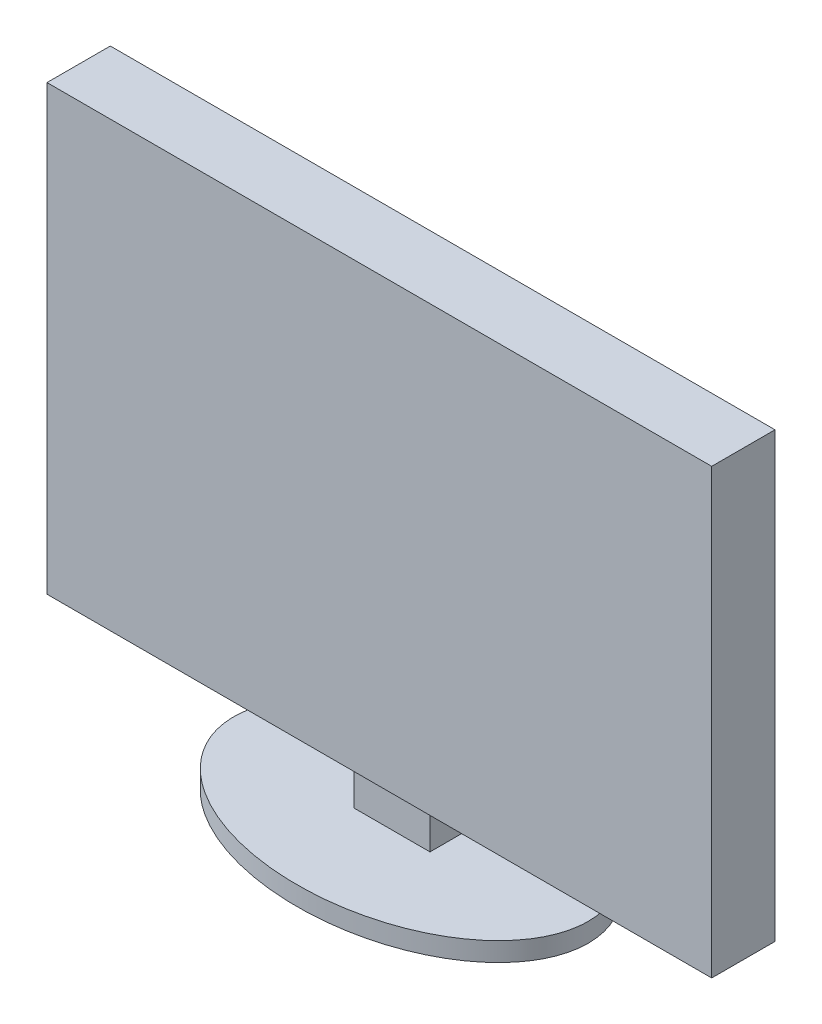
ISO-10303-21;
HEADER;
FILE_DESCRIPTION(('STEP AP214'),'2;1');
FILE_NAME('part.step','',(''),(''),'','','');
FILE_SCHEMA(('AUTOMOTIVE_DESIGN { 1 0 10303 214 1 1 1 1 }'));
ENDSEC;
DATA;
#1=APPLICATION_CONTEXT('core data for automotive mechanical design processes');
#2=APPLICATION_PROTOCOL_DEFINITION('international standard','automotive_design',2000,#1);
#3=PRODUCT_CONTEXT('',#1,'mechanical');
#4=PRODUCT('Part','Part','',(#3));
#5=PRODUCT_RELATED_PRODUCT_CATEGORY('part','',(#4));
#6=PRODUCT_DEFINITION_FORMATION('','',#4);
#7=PRODUCT_DEFINITION_CONTEXT('part definition',#1,'design');
#8=PRODUCT_DEFINITION('design','',#6,#7);
#9=PRODUCT_DEFINITION_SHAPE('','',#8);
#10=(LENGTH_UNIT() NAMED_UNIT(*) SI_UNIT(.MILLI.,.METRE.));
#11=(NAMED_UNIT(*) PLANE_ANGLE_UNIT() SI_UNIT($,.RADIAN.));
#12=(NAMED_UNIT(*) SI_UNIT($,.STERADIAN.) SOLID_ANGLE_UNIT());
#13=UNCERTAINTY_MEASURE_WITH_UNIT(LENGTH_MEASURE(1.E-05),#10,'distance_accuracy_value','');
#14=(GEOMETRIC_REPRESENTATION_CONTEXT(3) GLOBAL_UNCERTAINTY_ASSIGNED_CONTEXT((#13)) GLOBAL_UNIT_ASSIGNED_CONTEXT((#10,
#11,#12)) REPRESENTATION_CONTEXT('',''));
#15=CARTESIAN_POINT('',(0.,0.,0.));
#16=DIRECTION('',(0.,0.,1.));
#17=DIRECTION('',(1.,0.,0.));
#18=AXIS2_PLACEMENT_3D('',#15,#16,#17);
#19=CARTESIAN_POINT('',(0.,15.,0.));
#20=DIRECTION('',(0.,1.,0.));
#21=DIRECTION('',(0.,0.,1.));
#22=AXIS2_PLACEMENT_3D('',#19,#20,#21);
#23=PLANE('',#22);
#24=CARTESIAN_POINT('',(0.,15.,0.));
#25=DIRECTION('',(0.,1.,0.));
#26=DIRECTION('',(1.,0.,0.));
#27=AXIS2_PLACEMENT_3D('',#24,#25,#26);
#28=ELLIPSE('',#27,140.,90.);
#29=CARTESIAN_POINT('',(140.,15.,0.));
#30=VERTEX_POINT('',#29);
#31=EDGE_CURVE('E11',#30,#30,#28,.T.);
#32=ORIENTED_EDGE('',*,*,#31,.T.);
#33=EDGE_LOOP('',(#32));
#34=FACE_BOUND('',#33,.T.);
#35=DIRECTION('',(-1.,0.,0.));
#36=VECTOR('',#35,1.);
#37=CARTESIAN_POINT('',(-30.,15.,-15.));
#38=LINE('',#37,#36);
#39=CARTESIAN_POINT('',(30.,15.,-15.));
#40=VERTEX_POINT('',#39);
#41=CARTESIAN_POINT('',(-30.,15.,-15.));
#42=VERTEX_POINT('',#41);
#43=EDGE_CURVE('E132',#40,#42,#38,.T.);
#44=ORIENTED_EDGE('',*,*,#43,.F.);
#45=DIRECTION('',(0.,0.,-1.));
#46=VECTOR('',#45,1.);
#47=CARTESIAN_POINT('',(30.,15.,15.));
#48=LINE('',#47,#46);
#49=CARTESIAN_POINT('',(30.,15.,15.));
#50=VERTEX_POINT('',#49);
#51=EDGE_CURVE('E129',#50,#40,#48,.T.);
#52=ORIENTED_EDGE('',*,*,#51,.F.);
#53=DIRECTION('',(1.,0.,0.));
#54=VECTOR('',#53,1.);
#55=CARTESIAN_POINT('',(-30.,15.,15.));
#56=LINE('',#55,#54);
#57=CARTESIAN_POINT('',(-30.,15.,15.));
#58=VERTEX_POINT('',#57);
#59=EDGE_CURVE('E68',#58,#50,#56,.T.);
#60=ORIENTED_EDGE('',*,*,#59,.F.);
#61=DIRECTION('',(0.,0.,1.));
#62=VECTOR('',#61,1.);
#63=CARTESIAN_POINT('',(-30.,15.,15.));
#64=LINE('',#63,#62);
#65=EDGE_CURVE('E150',#42,#58,#64,.T.);
#66=ORIENTED_EDGE('',*,*,#65,.F.);
#67=EDGE_LOOP('',(#44,#52,#60,#66));
#68=FACE_BOUND('',#67,.T.);
#69=ADVANCED_FACE('F33',(#34,#68),#23,.T.);
#70=DIRECTION('',(0.,-1.,0.));
#71=VECTOR('',#70,1.);
#72=SURFACE_OF_LINEAR_EXTRUSION('',#28,#71);
#73=ORIENTED_EDGE('',*,*,#31,.F.);
#74=EDGE_LOOP('',(#73));
#75=FACE_BOUND('',#74,.T.);
#76=CARTESIAN_POINT('',(0.,0.,0.));
#77=DIRECTION('',(0.,1.,0.));
#78=DIRECTION('',(1.,0.,0.));
#79=AXIS2_PLACEMENT_3D('',#76,#77,#78);
#80=ELLIPSE('',#79,140.,90.);
#81=CARTESIAN_POINT('',(140.,0.,0.));
#82=VERTEX_POINT('',#81);
#83=EDGE_CURVE('E38',#82,#82,#80,.T.);
#84=ORIENTED_EDGE('',*,*,#83,.T.);
#85=EDGE_LOOP('',(#84));
#86=FACE_BOUND('',#85,.T.);
#87=ADVANCED_FACE('F35',(#75,#86),#72,.F.);
#88=CARTESIAN_POINT('',(0.,0.,0.));
#89=DIRECTION('',(0.,1.,0.));
#90=DIRECTION('',(0.,0.,1.));
#91=AXIS2_PLACEMENT_3D('',#88,#89,#90);
#92=PLANE('',#91);
#93=ORIENTED_EDGE('',*,*,#83,.F.);
#94=EDGE_LOOP('',(#93));
#95=FACE_BOUND('',#94,.T.);
#96=ADVANCED_FACE('F164',(#95),#92,.F.);
#97=CARTESIAN_POINT('',(30.,50.,15.));
#98=DIRECTION('',(-1.,0.,0.));
#99=DIRECTION('',(0.,0.,1.));
#100=AXIS2_PLACEMENT_3D('',#97,#98,#99);
#101=PLANE('',#100);
#102=ORIENTED_EDGE('',*,*,#51,.T.);
#103=DIRECTION('',(0.,-1.,0.));
#104=VECTOR('',#103,1.);
#105=CARTESIAN_POINT('',(30.,50.,-15.));
#106=LINE('',#105,#104);
#107=CARTESIAN_POINT('',(30.,50.,-15.));
#108=VERTEX_POINT('',#107);
#109=EDGE_CURVE('E158',#108,#40,#106,.T.);
#110=ORIENTED_EDGE('',*,*,#109,.F.);
#111=DIRECTION('',(0.,0.,-1.));
#112=VECTOR('',#111,1.);
#113=CARTESIAN_POINT('',(30.,50.,15.));
#114=LINE('',#113,#112);
#115=CARTESIAN_POINT('',(30.,50.,15.));
#116=VERTEX_POINT('',#115);
#117=EDGE_CURVE('E138',#116,#108,#114,.T.);
#118=ORIENTED_EDGE('',*,*,#117,.F.);
#119=DIRECTION('',(0.,-1.,0.));
#120=VECTOR('',#119,1.);
#121=CARTESIAN_POINT('',(30.,50.,15.));
#122=LINE('',#121,#120);
#123=EDGE_CURVE('E147',#116,#50,#122,.T.);
#124=ORIENTED_EDGE('',*,*,#123,.T.);
#125=EDGE_LOOP('',(#102,#110,#118,#124));
#126=FACE_BOUND('',#125,.T.);
#127=ADVANCED_FACE('F166',(#126),#101,.F.);
#128=CARTESIAN_POINT('',(-30.,50.,-15.));
#129=DIRECTION('',(0.,0.,1.));
#130=DIRECTION('',(1.,0.,0.));
#131=AXIS2_PLACEMENT_3D('',#128,#129,#130);
#132=PLANE('',#131);
#133=ORIENTED_EDGE('',*,*,#43,.T.);
#134=DIRECTION('',(0.,-1.,0.));
#135=VECTOR('',#134,1.);
#136=CARTESIAN_POINT('',(-30.,50.,-15.));
#137=LINE('',#136,#135);
#138=CARTESIAN_POINT('',(-30.,50.,-15.));
#139=VERTEX_POINT('',#138);
#140=EDGE_CURVE('E155',#139,#42,#137,.T.);
#141=ORIENTED_EDGE('',*,*,#140,.F.);
#142=DIRECTION('',(-1.,0.,0.));
#143=VECTOR('',#142,1.);
#144=CARTESIAN_POINT('',(-30.,50.,-15.));
#145=LINE('',#144,#143);
#146=EDGE_CURVE('E73',#108,#139,#145,.T.);
#147=ORIENTED_EDGE('',*,*,#146,.F.);
#148=ORIENTED_EDGE('',*,*,#109,.T.);
#149=EDGE_LOOP('',(#133,#141,#147,#148));
#150=FACE_BOUND('',#149,.T.);
#151=ADVANCED_FACE('F171',(#150),#132,.F.);
#152=CARTESIAN_POINT('',(-30.,50.,15.));
#153=DIRECTION('',(1.,0.,0.));
#154=DIRECTION('',(0.,0.,-1.));
#155=AXIS2_PLACEMENT_3D('',#152,#153,#154);
#156=PLANE('',#155);
#157=ORIENTED_EDGE('',*,*,#65,.T.);
#158=DIRECTION('',(0.,-1.,0.));
#159=VECTOR('',#158,1.);
#160=CARTESIAN_POINT('',(-30.,50.,15.));
#161=LINE('',#160,#159);
#162=CARTESIAN_POINT('',(-30.,50.,15.));
#163=VERTEX_POINT('',#162);
#164=EDGE_CURVE('E48',#163,#58,#161,.T.);
#165=ORIENTED_EDGE('',*,*,#164,.F.);
#166=DIRECTION('',(0.,0.,1.));
#167=VECTOR('',#166,1.);
#168=CARTESIAN_POINT('',(-30.,50.,15.));
#169=LINE('',#168,#167);
#170=EDGE_CURVE('E142',#139,#163,#169,.T.);
#171=ORIENTED_EDGE('',*,*,#170,.F.);
#172=ORIENTED_EDGE('',*,*,#140,.T.);
#173=EDGE_LOOP('',(#157,#165,#171,#172));
#174=FACE_BOUND('',#173,.T.);
#175=ADVANCED_FACE('F184',(#174),#156,.F.);
#176=CARTESIAN_POINT('',(-30.,50.,15.));
#177=DIRECTION('',(0.,0.,-1.));
#178=DIRECTION('',(-1.,0.,0.));
#179=AXIS2_PLACEMENT_3D('',#176,#177,#178);
#180=PLANE('',#179);
#181=ORIENTED_EDGE('',*,*,#59,.T.);
#182=ORIENTED_EDGE('',*,*,#123,.F.);
#183=DIRECTION('',(1.,0.,0.));
#184=VECTOR('',#183,1.);
#185=CARTESIAN_POINT('',(-30.,50.,15.));
#186=LINE('',#185,#184);
#187=EDGE_CURVE('E145',#163,#116,#186,.T.);
#188=ORIENTED_EDGE('',*,*,#187,.F.);
#189=ORIENTED_EDGE('',*,*,#164,.T.);
#190=EDGE_LOOP('',(#181,#182,#188,#189));
#191=FACE_BOUND('',#190,.T.);
#192=ADVANCED_FACE('F187',(#191),#180,.F.);
#193=CARTESIAN_POINT('',(0.,50.,0.));
#194=DIRECTION('',(0.,-1.,0.));
#195=DIRECTION('',(0.,0.,-1.));
#196=AXIS2_PLACEMENT_3D('',#193,#194,#195);
#197=PLANE('',#196);
#198=DIRECTION('',(0.,0.,-1.));
#199=VECTOR('',#198,1.);
#200=CARTESIAN_POINT('',(262.5,50.,25.));
#201=LINE('',#200,#199);
#202=CARTESIAN_POINT('',(262.5,50.,25.));
#203=VERTEX_POINT('',#202);
#204=CARTESIAN_POINT('',(262.5,50.,-25.));
#205=VERTEX_POINT('',#204);
#206=EDGE_CURVE('E128',#203,#205,#201,.T.);
#207=ORIENTED_EDGE('',*,*,#206,.F.);
#208=DIRECTION('',(1.,0.,0.));
#209=VECTOR('',#208,1.);
#210=CARTESIAN_POINT('',(-262.5,50.,25.));
#211=LINE('',#210,#209);
#212=CARTESIAN_POINT('',(-262.5,50.,25.));
#213=VERTEX_POINT('',#212);
#214=EDGE_CURVE('E124',#213,#203,#211,.T.);
#215=ORIENTED_EDGE('',*,*,#214,.F.);
#216=DIRECTION('',(0.,0.,1.));
#217=VECTOR('',#216,1.);
#218=CARTESIAN_POINT('',(-262.5,50.,25.));
#219=LINE('',#218,#217);
#220=CARTESIAN_POINT('',(-262.5,50.,-25.));
#221=VERTEX_POINT('',#220);
#222=EDGE_CURVE('E289',#221,#213,#219,.T.);
#223=ORIENTED_EDGE('',*,*,#222,.F.);
#224=DIRECTION('',(-1.,0.,0.));
#225=VECTOR('',#224,1.);
#226=CARTESIAN_POINT('',(-262.5,50.,-25.));
#227=LINE('',#226,#225);
#228=EDGE_CURVE('E287',#205,#221,#227,.T.);
#229=ORIENTED_EDGE('',*,*,#228,.F.);
#230=EDGE_LOOP('',(#207,#215,#223,#229));
#231=FACE_BOUND('',#230,.T.);
#232=ORIENTED_EDGE('',*,*,#117,.T.);
#233=ORIENTED_EDGE('',*,*,#146,.T.);
#234=ORIENTED_EDGE('',*,*,#170,.T.);
#235=ORIENTED_EDGE('',*,*,#187,.T.);
#236=EDGE_LOOP('',(#232,#233,#234,#235));
#237=FACE_BOUND('',#236,.T.);
#238=ADVANCED_FACE('F190',(#231,#237),#197,.T.);
#239=CARTESIAN_POINT('',(262.5,400.,25.));
#240=DIRECTION('',(-1.,0.,0.));
#241=DIRECTION('',(0.,0.,1.));
#242=AXIS2_PLACEMENT_3D('',#239,#240,#241);
#243=PLANE('',#242);
#244=ORIENTED_EDGE('',*,*,#206,.T.);
#245=DIRECTION('',(0.,-1.,0.));
#246=VECTOR('',#245,1.);
#247=CARTESIAN_POINT('',(262.5,400.,-25.));
#248=LINE('',#247,#246);
#249=CARTESIAN_POINT('',(262.5,400.,-25.));
#250=VERTEX_POINT('',#249);
#251=EDGE_CURVE('E108',#250,#205,#248,.T.);
#252=ORIENTED_EDGE('',*,*,#251,.F.);
#253=DIRECTION('',(0.,0.,-1.));
#254=VECTOR('',#253,1.);
#255=CARTESIAN_POINT('',(262.5,400.,25.));
#256=LINE('',#255,#254);
#257=CARTESIAN_POINT('',(262.5,400.,25.));
#258=VERTEX_POINT('',#257);
#259=EDGE_CURVE('E115',#258,#250,#256,.T.);
#260=ORIENTED_EDGE('',*,*,#259,.F.);
#261=DIRECTION('',(0.,-1.,0.));
#262=VECTOR('',#261,1.);
#263=CARTESIAN_POINT('',(262.5,400.,25.));
#264=LINE('',#263,#262);
#265=EDGE_CURVE('E296',#258,#203,#264,.T.);
#266=ORIENTED_EDGE('',*,*,#265,.T.);
#267=EDGE_LOOP('',(#244,#252,#260,#266));
#268=FACE_BOUND('',#267,.T.);
#269=ADVANCED_FACE('F126',(#268),#243,.F.);
#270=CARTESIAN_POINT('',(-262.5,400.,-25.));
#271=DIRECTION('',(0.,0.,1.));
#272=DIRECTION('',(1.,0.,0.));
#273=AXIS2_PLACEMENT_3D('',#270,#271,#272);
#274=PLANE('',#273);
#275=ORIENTED_EDGE('',*,*,#228,.T.);
#276=DIRECTION('',(0.,-1.,0.));
#277=VECTOR('',#276,1.);
#278=CARTESIAN_POINT('',(-262.5,400.,-25.));
#279=LINE('',#278,#277);
#280=CARTESIAN_POINT('',(-262.5,400.,-25.));
#281=VERTEX_POINT('',#280);
#282=EDGE_CURVE('E111',#281,#221,#279,.T.);
#283=ORIENTED_EDGE('',*,*,#282,.F.);
#284=DIRECTION('',(-1.,0.,0.));
#285=VECTOR('',#284,1.);
#286=CARTESIAN_POINT('',(-262.5,400.,-25.));
#287=LINE('',#286,#285);
#288=EDGE_CURVE('E104',#250,#281,#287,.T.);
#289=ORIENTED_EDGE('',*,*,#288,.F.);
#290=ORIENTED_EDGE('',*,*,#251,.T.);
#291=EDGE_LOOP('',(#275,#283,#289,#290));
#292=FACE_BOUND('',#291,.T.);
#293=ADVANCED_FACE('F106',(#292),#274,.F.);
#294=CARTESIAN_POINT('',(-262.5,400.,25.));
#295=DIRECTION('',(1.,0.,0.));
#296=DIRECTION('',(0.,0.,-1.));
#297=AXIS2_PLACEMENT_3D('',#294,#295,#296);
#298=PLANE('',#297);
#299=ORIENTED_EDGE('',*,*,#222,.T.);
#300=DIRECTION('',(0.,-1.,0.));
#301=VECTOR('',#300,1.);
#302=CARTESIAN_POINT('',(-262.5,400.,25.));
#303=LINE('',#302,#301);
#304=CARTESIAN_POINT('',(-262.5,400.,25.));
#305=VERTEX_POINT('',#304);
#306=EDGE_CURVE('E134',#305,#213,#303,.T.);
#307=ORIENTED_EDGE('',*,*,#306,.F.);
#308=DIRECTION('',(0.,0.,1.));
#309=VECTOR('',#308,1.);
#310=CARTESIAN_POINT('',(-262.5,400.,25.));
#311=LINE('',#310,#309);
#312=EDGE_CURVE('E114',#281,#305,#311,.T.);
#313=ORIENTED_EDGE('',*,*,#312,.F.);
#314=ORIENTED_EDGE('',*,*,#282,.T.);
#315=EDGE_LOOP('',(#299,#307,#313,#314));
#316=FACE_BOUND('',#315,.T.);
#317=ADVANCED_FACE('F195',(#316),#298,.F.);
#318=CARTESIAN_POINT('',(-262.5,400.,25.));
#319=DIRECTION('',(0.,0.,-1.));
#320=DIRECTION('',(-1.,0.,0.));
#321=AXIS2_PLACEMENT_3D('',#318,#319,#320);
#322=PLANE('',#321);
#323=ORIENTED_EDGE('',*,*,#214,.T.);
#324=ORIENTED_EDGE('',*,*,#265,.F.);
#325=DIRECTION('',(1.,0.,0.));
#326=VECTOR('',#325,1.);
#327=CARTESIAN_POINT('',(-262.5,400.,25.));
#328=LINE('',#327,#326);
#329=EDGE_CURVE('E120',#305,#258,#328,.T.);
#330=ORIENTED_EDGE('',*,*,#329,.F.);
#331=ORIENTED_EDGE('',*,*,#306,.T.);
#332=EDGE_LOOP('',(#323,#324,#330,#331));
#333=FACE_BOUND('',#332,.T.);
#334=ADVANCED_FACE('F198',(#333),#322,.F.);
#335=CARTESIAN_POINT('',(0.,400.,0.));
#336=DIRECTION('',(0.,-1.,0.));
#337=DIRECTION('',(0.,0.,-1.));
#338=AXIS2_PLACEMENT_3D('',#335,#336,#337);
#339=PLANE('',#338);
#340=ORIENTED_EDGE('',*,*,#259,.T.);
#341=ORIENTED_EDGE('',*,*,#288,.T.);
#342=ORIENTED_EDGE('',*,*,#312,.T.);
#343=ORIENTED_EDGE('',*,*,#329,.T.);
#344=EDGE_LOOP('',(#340,#341,#342,#343));
#345=FACE_BOUND('',#344,.T.);
#346=ADVANCED_FACE('F118',(#345),#339,.F.);
#347=CLOSED_SHELL('',(#69,#87,#96,#127,#151,#175,#192,#238,#269,#293,#317,#334,#346));
#348=MANIFOLD_SOLID_BREP('B2',#347);
#349=ADVANCED_BREP_SHAPE_REPRESENTATION('',(#18,#348),#14);
#350=SHAPE_DEFINITION_REPRESENTATION(#9,#349);
ENDSEC;
END-ISO-10303-21;
